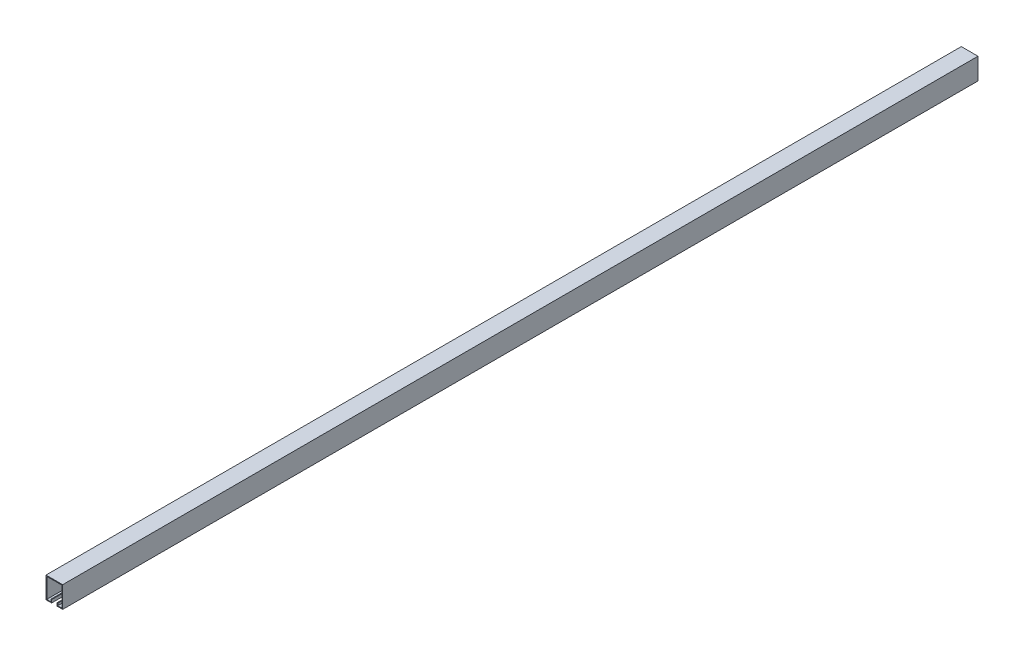
ISO-10303-21;
HEADER;
FILE_DESCRIPTION(('STEP AP214'),'2;1');
FILE_NAME('part.step','',(''),(''),'','','');
FILE_SCHEMA(('AUTOMOTIVE_DESIGN { 1 0 10303 214 1 1 1 1 }'));
ENDSEC;
DATA;
#1=APPLICATION_CONTEXT('core data for automotive mechanical design processes');
#2=APPLICATION_PROTOCOL_DEFINITION('international standard','automotive_design',2000,#1);
#3=PRODUCT_CONTEXT('',#1,'mechanical');
#4=PRODUCT('Part','Part','',(#3));
#5=PRODUCT_RELATED_PRODUCT_CATEGORY('part','',(#4));
#6=PRODUCT_DEFINITION_FORMATION('','',#4);
#7=PRODUCT_DEFINITION_CONTEXT('part definition',#1,'design');
#8=PRODUCT_DEFINITION('design','',#6,#7);
#9=PRODUCT_DEFINITION_SHAPE('','',#8);
#10=(LENGTH_UNIT() NAMED_UNIT(*) SI_UNIT(.MILLI.,.METRE.));
#11=(NAMED_UNIT(*) PLANE_ANGLE_UNIT() SI_UNIT($,.RADIAN.));
#12=(NAMED_UNIT(*) SI_UNIT($,.STERADIAN.) SOLID_ANGLE_UNIT());
#13=UNCERTAINTY_MEASURE_WITH_UNIT(LENGTH_MEASURE(1.E-05),#10,'distance_accuracy_value','');
#14=(GEOMETRIC_REPRESENTATION_CONTEXT(3) GLOBAL_UNCERTAINTY_ASSIGNED_CONTEXT((#13)) GLOBAL_UNIT_ASSIGNED_CONTEXT((#10,
#11,#12)) REPRESENTATION_CONTEXT('',''));
#15=CARTESIAN_POINT('',(0.,0.,0.));
#16=DIRECTION('',(0.,0.,1.));
#17=DIRECTION('',(1.,0.,0.));
#18=AXIS2_PLACEMENT_3D('',#15,#16,#17);
#19=CARTESIAN_POINT('',(0.,-57.15,2440.));
#20=DIRECTION('',(0.,1.,0.));
#21=DIRECTION('',(0.,0.,1.));
#22=AXIS2_PLACEMENT_3D('',#19,#20,#21);
#23=PLANE('',#22);
#24=DIRECTION('',(1.,0.,0.));
#25=VECTOR('',#24,1.);
#26=CARTESIAN_POINT('',(0.,-57.15,0.));
#27=LINE('',#26,#25);
#28=CARTESIAN_POINT('',(0.,-57.15,0.));
#29=VERTEX_POINT('',#28);
#30=CARTESIAN_POINT('',(15.,-57.15,0.));
#31=VERTEX_POINT('',#30);
#32=EDGE_CURVE('E190',#29,#31,#27,.T.);
#33=ORIENTED_EDGE('',*,*,#32,.T.);
#34=DIRECTION('',(0.,0.,1.));
#35=VECTOR('',#34,1.);
#36=CARTESIAN_POINT('',(15.,-57.15,-68.3938959264641));
#37=LINE('',#36,#35);
#38=CARTESIAN_POINT('',(15.,-57.15,2440.));
#39=VERTEX_POINT('',#38);
#40=EDGE_CURVE('E374',#31,#39,#37,.T.);
#41=ORIENTED_EDGE('',*,*,#40,.T.);
#42=DIRECTION('',(1.,0.,0.));
#43=VECTOR('',#42,1.);
#44=CARTESIAN_POINT('',(0.,-57.15,2440.));
#45=LINE('',#44,#43);
#46=CARTESIAN_POINT('',(0.,-57.15,2440.));
#47=VERTEX_POINT('',#46);
#48=EDGE_CURVE('E85',#47,#39,#45,.T.);
#49=ORIENTED_EDGE('',*,*,#48,.F.);
#50=DIRECTION('',(0.,0.,-1.));
#51=VECTOR('',#50,1.);
#52=CARTESIAN_POINT('',(0.,-57.15,2440.));
#53=LINE('',#52,#51);
#54=EDGE_CURVE('E11',#47,#29,#53,.T.);
#55=ORIENTED_EDGE('',*,*,#54,.T.);
#56=EDGE_LOOP('',(#33,#41,#49,#55));
#57=FACE_BOUND('',#56,.T.);
#58=ADVANCED_FACE('F33',(#57),#23,.F.);
#59=CARTESIAN_POINT('',(0.,0.,2440.));
#60=DIRECTION('',(1.,0.,0.));
#61=DIRECTION('',(0.,1.,0.));
#62=AXIS2_PLACEMENT_3D('',#59,#60,#61);
#63=PLANE('',#62);
#64=DIRECTION('',(0.,-1.,0.));
#65=VECTOR('',#64,1.);
#66=CARTESIAN_POINT('',(0.,0.,0.));
#67=LINE('',#66,#65);
#68=CARTESIAN_POINT('',(0.,0.,0.));
#69=VERTEX_POINT('',#68);
#70=EDGE_CURVE('E186',#69,#29,#67,.T.);
#71=ORIENTED_EDGE('',*,*,#70,.T.);
#72=ORIENTED_EDGE('',*,*,#54,.F.);
#73=DIRECTION('',(0.,-1.,0.));
#74=VECTOR('',#73,1.);
#75=CARTESIAN_POINT('',(0.,0.,2440.));
#76=LINE('',#75,#74);
#77=CARTESIAN_POINT('',(0.,0.,2440.));
#78=VERTEX_POINT('',#77);
#79=EDGE_CURVE('E177',#78,#47,#76,.T.);
#80=ORIENTED_EDGE('',*,*,#79,.F.);
#81=DIRECTION('',(0.,0.,-1.));
#82=VECTOR('',#81,1.);
#83=CARTESIAN_POINT('',(0.,0.,2440.));
#84=LINE('',#83,#82);
#85=EDGE_CURVE('E185',#78,#69,#84,.T.);
#86=ORIENTED_EDGE('',*,*,#85,.T.);
#87=EDGE_LOOP('',(#71,#72,#80,#86));
#88=FACE_BOUND('',#87,.T.);
#89=ADVANCED_FACE('F35',(#88),#63,.F.);
#90=CARTESIAN_POINT('',(29.45,-57.15,2440.));
#91=VERTEX_POINT('',#90);
#92=CARTESIAN_POINT('',(44.45,-57.15,2440.));
#93=VERTEX_POINT('',#92);
#94=EDGE_CURVE('E168',#91,#93,#45,.T.);
#95=ORIENTED_EDGE('',*,*,#94,.F.);
#96=DIRECTION('',(0.,0.,1.));
#97=VECTOR('',#96,1.);
#98=CARTESIAN_POINT('',(29.45,-57.15,-68.3938959264641));
#99=LINE('',#98,#97);
#100=CARTESIAN_POINT('',(29.45,-57.15,0.));
#101=VERTEX_POINT('',#100);
#102=EDGE_CURVE('E154',#101,#91,#99,.T.);
#103=ORIENTED_EDGE('',*,*,#102,.F.);
#104=CARTESIAN_POINT('',(44.45,-57.15,0.));
#105=VERTEX_POINT('',#104);
#106=EDGE_CURVE('E189',#101,#105,#27,.T.);
#107=ORIENTED_EDGE('',*,*,#106,.T.);
#108=DIRECTION('',(0.,0.,-1.));
#109=VECTOR('',#108,1.);
#110=CARTESIAN_POINT('',(44.45,-57.15,2440.));
#111=LINE('',#110,#109);
#112=EDGE_CURVE('E41',#93,#105,#111,.T.);
#113=ORIENTED_EDGE('',*,*,#112,.F.);
#114=EDGE_LOOP('',(#95,#103,#107,#113));
#115=FACE_BOUND('',#114,.T.);
#116=ADVANCED_FACE('F174',(#115),#23,.F.);
#117=CARTESIAN_POINT('',(44.45,0.,2440.));
#118=DIRECTION('',(-1.,0.,0.));
#119=DIRECTION('',(0.,0.,1.));
#120=AXIS2_PLACEMENT_3D('',#117,#118,#119);
#121=PLANE('',#120);
#122=DIRECTION('',(0.,1.,0.));
#123=VECTOR('',#122,1.);
#124=CARTESIAN_POINT('',(44.45,0.,0.));
#125=LINE('',#124,#123);
#126=CARTESIAN_POINT('',(44.45,0.,0.));
#127=VERTEX_POINT('',#126);
#128=EDGE_CURVE('E193',#105,#127,#125,.T.);
#129=ORIENTED_EDGE('',*,*,#128,.T.);
#130=DIRECTION('',(0.,0.,-1.));
#131=VECTOR('',#130,1.);
#132=CARTESIAN_POINT('',(44.45,0.,2440.));
#133=LINE('',#132,#131);
#134=CARTESIAN_POINT('',(44.45,0.,2440.));
#135=VERTEX_POINT('',#134);
#136=EDGE_CURVE('E197',#135,#127,#133,.T.);
#137=ORIENTED_EDGE('',*,*,#136,.F.);
#138=DIRECTION('',(0.,1.,0.));
#139=VECTOR('',#138,1.);
#140=CARTESIAN_POINT('',(44.45,0.,2440.));
#141=LINE('',#140,#139);
#142=EDGE_CURVE('E179',#93,#135,#141,.T.);
#143=ORIENTED_EDGE('',*,*,#142,.F.);
#144=ORIENTED_EDGE('',*,*,#112,.T.);
#145=EDGE_LOOP('',(#129,#137,#143,#144));
#146=FACE_BOUND('',#145,.T.);
#147=ADVANCED_FACE('F200',(#146),#121,.F.);
#148=CARTESIAN_POINT('',(0.,0.,2440.));
#149=DIRECTION('',(0.,-1.,0.));
#150=DIRECTION('',(0.,0.,-1.));
#151=AXIS2_PLACEMENT_3D('',#148,#149,#150);
#152=PLANE('',#151);
#153=DIRECTION('',(-1.,0.,0.));
#154=VECTOR('',#153,1.);
#155=CARTESIAN_POINT('',(0.,0.,0.));
#156=LINE('',#155,#154);
#157=EDGE_CURVE('E78',#127,#69,#156,.T.);
#158=ORIENTED_EDGE('',*,*,#157,.T.);
#159=ORIENTED_EDGE('',*,*,#85,.F.);
#160=DIRECTION('',(-1.,0.,0.));
#161=VECTOR('',#160,1.);
#162=CARTESIAN_POINT('',(0.,0.,2440.));
#163=LINE('',#162,#161);
#164=EDGE_CURVE('E57',#135,#78,#163,.T.);
#165=ORIENTED_EDGE('',*,*,#164,.F.);
#166=ORIENTED_EDGE('',*,*,#136,.T.);
#167=EDGE_LOOP('',(#158,#159,#165,#166));
#168=FACE_BOUND('',#167,.T.);
#169=ADVANCED_FACE('F210',(#168),#152,.F.);
#170=CARTESIAN_POINT('',(0.,0.,2440.));
#171=DIRECTION('',(0.,0.,1.));
#172=DIRECTION('',(1.,0.,0.));
#173=AXIS2_PLACEMENT_3D('',#170,#171,#172);
#174=PLANE('',#173);
#175=DIRECTION('',(0.,-1.,0.));
#176=VECTOR('',#175,1.);
#177=CARTESIAN_POINT('',(15.,-57.15,2440.));
#178=LINE('',#177,#176);
#179=CARTESIAN_POINT('',(15.,-49.15,2440.));
#180=VERTEX_POINT('',#179);
#181=EDGE_CURVE('E164',#180,#39,#178,.T.);
#182=ORIENTED_EDGE('',*,*,#181,.F.);
#183=DIRECTION('',(1.,0.,0.));
#184=VECTOR('',#183,1.);
#185=CARTESIAN_POINT('',(15.,-49.15,2440.));
#186=LINE('',#185,#184);
#187=CARTESIAN_POINT('',(13.,-49.15,2440.));
#188=VERTEX_POINT('',#187);
#189=EDGE_CURVE('E400',#188,#180,#186,.T.);
#190=ORIENTED_EDGE('',*,*,#189,.F.);
#191=DIRECTION('',(0.,1.,0.));
#192=VECTOR('',#191,1.);
#193=CARTESIAN_POINT('',(13.,-49.15,2440.));
#194=LINE('',#193,#192);
#195=CARTESIAN_POINT('',(13.,-55.15,2440.));
#196=VERTEX_POINT('',#195);
#197=EDGE_CURVE('E403',#196,#188,#194,.T.);
#198=ORIENTED_EDGE('',*,*,#197,.F.);
#199=DIRECTION('',(1.,0.,0.));
#200=VECTOR('',#199,1.);
#201=CARTESIAN_POINT('',(13.,-55.15,2440.));
#202=LINE('',#201,#200);
#203=CARTESIAN_POINT('',(2.,-55.15,2440.));
#204=VERTEX_POINT('',#203);
#205=EDGE_CURVE('E406',#204,#196,#202,.T.);
#206=ORIENTED_EDGE('',*,*,#205,.F.);
#207=DIRECTION('',(0.,-1.,0.));
#208=VECTOR('',#207,1.);
#209=CARTESIAN_POINT('',(2.,-55.15,2440.));
#210=LINE('',#209,#208);
#211=CARTESIAN_POINT('',(2.,-2.,2440.));
#212=VERTEX_POINT('',#211);
#213=EDGE_CURVE('E409',#212,#204,#210,.T.);
#214=ORIENTED_EDGE('',*,*,#213,.F.);
#215=DIRECTION('',(-1.,0.,0.));
#216=VECTOR('',#215,1.);
#217=CARTESIAN_POINT('',(2.,-2.,2440.));
#218=LINE('',#217,#216);
#219=CARTESIAN_POINT('',(42.45,-2.,2440.));
#220=VERTEX_POINT('',#219);
#221=EDGE_CURVE('E412',#220,#212,#218,.T.);
#222=ORIENTED_EDGE('',*,*,#221,.F.);
#223=DIRECTION('',(0.,1.,0.));
#224=VECTOR('',#223,1.);
#225=CARTESIAN_POINT('',(42.45,-2.,2440.));
#226=LINE('',#225,#224);
#227=CARTESIAN_POINT('',(42.45,-55.15,2440.));
#228=VERTEX_POINT('',#227);
#229=EDGE_CURVE('E415',#228,#220,#226,.T.);
#230=ORIENTED_EDGE('',*,*,#229,.F.);
#231=DIRECTION('',(1.,0.,0.));
#232=VECTOR('',#231,1.);
#233=CARTESIAN_POINT('',(42.45,-55.15,2440.));
#234=LINE('',#233,#232);
#235=CARTESIAN_POINT('',(31.45,-55.15,2440.));
#236=VERTEX_POINT('',#235);
#237=EDGE_CURVE('E418',#236,#228,#234,.T.);
#238=ORIENTED_EDGE('',*,*,#237,.F.);
#239=DIRECTION('',(0.,-1.,0.));
#240=VECTOR('',#239,1.);
#241=CARTESIAN_POINT('',(31.45,-55.15,2440.));
#242=LINE('',#241,#240);
#243=CARTESIAN_POINT('',(31.45,-49.15,2440.));
#244=VERTEX_POINT('',#243);
#245=EDGE_CURVE('E421',#244,#236,#242,.T.);
#246=ORIENTED_EDGE('',*,*,#245,.F.);
#247=DIRECTION('',(1.,0.,0.));
#248=VECTOR('',#247,1.);
#249=CARTESIAN_POINT('',(31.45,-49.15,2440.));
#250=LINE('',#249,#248);
#251=CARTESIAN_POINT('',(29.45,-49.15,2440.));
#252=VERTEX_POINT('',#251);
#253=EDGE_CURVE('E172',#252,#244,#250,.T.);
#254=ORIENTED_EDGE('',*,*,#253,.F.);
#255=DIRECTION('',(0.,1.,0.));
#256=VECTOR('',#255,1.);
#257=CARTESIAN_POINT('',(29.45,-49.15,2440.));
#258=LINE('',#257,#256);
#259=EDGE_CURVE('E157',#91,#252,#258,.T.);
#260=ORIENTED_EDGE('',*,*,#259,.F.);
#261=ORIENTED_EDGE('',*,*,#94,.T.);
#262=ORIENTED_EDGE('',*,*,#142,.T.);
#263=ORIENTED_EDGE('',*,*,#164,.T.);
#264=ORIENTED_EDGE('',*,*,#79,.T.);
#265=ORIENTED_EDGE('',*,*,#48,.T.);
#266=EDGE_LOOP('',(#182,#190,#198,#206,#214,#222,#230,#238,#246,#254,#260,#261,#262,#263,#264,#265));
#267=FACE_BOUND('',#266,.T.);
#268=ADVANCED_FACE('F167',(#267),#174,.T.);
#269=CARTESIAN_POINT('',(0.,0.,0.));
#270=DIRECTION('',(0.,0.,1.));
#271=DIRECTION('',(1.,0.,0.));
#272=AXIS2_PLACEMENT_3D('',#269,#270,#271);
#273=PLANE('',#272);
#274=DIRECTION('',(-1.,0.,0.));
#275=VECTOR('',#274,1.);
#276=CARTESIAN_POINT('',(15.,-49.15,0.));
#277=LINE('',#276,#275);
#278=CARTESIAN_POINT('',(15.,-49.15,0.));
#279=VERTEX_POINT('',#278);
#280=CARTESIAN_POINT('',(13.,-49.15,0.));
#281=VERTEX_POINT('',#280);
#282=EDGE_CURVE('E377',#279,#281,#277,.T.);
#283=ORIENTED_EDGE('',*,*,#282,.F.);
#284=DIRECTION('',(0.,1.,0.));
#285=VECTOR('',#284,1.);
#286=CARTESIAN_POINT('',(15.,-57.15,0.));
#287=LINE('',#286,#285);
#288=EDGE_CURVE('E376',#31,#279,#287,.T.);
#289=ORIENTED_EDGE('',*,*,#288,.F.);
#290=ORIENTED_EDGE('',*,*,#32,.F.);
#291=ORIENTED_EDGE('',*,*,#70,.F.);
#292=ORIENTED_EDGE('',*,*,#157,.F.);
#293=ORIENTED_EDGE('',*,*,#128,.F.);
#294=ORIENTED_EDGE('',*,*,#106,.F.);
#295=DIRECTION('',(0.,-1.,0.));
#296=VECTOR('',#295,1.);
#297=CARTESIAN_POINT('',(29.45,-49.15,0.));
#298=LINE('',#297,#296);
#299=CARTESIAN_POINT('',(29.45,-49.15,0.));
#300=VERTEX_POINT('',#299);
#301=EDGE_CURVE('E160',#300,#101,#298,.T.);
#302=ORIENTED_EDGE('',*,*,#301,.F.);
#303=DIRECTION('',(-1.,0.,0.));
#304=VECTOR('',#303,1.);
#305=CARTESIAN_POINT('',(31.45,-49.15,0.));
#306=LINE('',#305,#304);
#307=CARTESIAN_POINT('',(31.45,-49.15,0.));
#308=VERTEX_POINT('',#307);
#309=EDGE_CURVE('E370',#308,#300,#306,.T.);
#310=ORIENTED_EDGE('',*,*,#309,.F.);
#311=DIRECTION('',(0.,1.,0.));
#312=VECTOR('',#311,1.);
#313=CARTESIAN_POINT('',(31.45,-55.15,0.));
#314=LINE('',#313,#312);
#315=CARTESIAN_POINT('',(31.45,-55.15,0.));
#316=VERTEX_POINT('',#315);
#317=EDGE_CURVE('E373',#316,#308,#314,.T.);
#318=ORIENTED_EDGE('',*,*,#317,.F.);
#319=DIRECTION('',(-1.,0.,0.));
#320=VECTOR('',#319,1.);
#321=CARTESIAN_POINT('',(42.45,-55.15,0.));
#322=LINE('',#321,#320);
#323=CARTESIAN_POINT('',(42.45,-55.15,0.));
#324=VERTEX_POINT('',#323);
#325=EDGE_CURVE('E436',#324,#316,#322,.T.);
#326=ORIENTED_EDGE('',*,*,#325,.F.);
#327=DIRECTION('',(0.,-1.,0.));
#328=VECTOR('',#327,1.);
#329=CARTESIAN_POINT('',(42.45,-2.,0.));
#330=LINE('',#329,#328);
#331=CARTESIAN_POINT('',(42.45,-2.,0.));
#332=VERTEX_POINT('',#331);
#333=EDGE_CURVE('E434',#332,#324,#330,.T.);
#334=ORIENTED_EDGE('',*,*,#333,.F.);
#335=DIRECTION('',(1.,0.,0.));
#336=VECTOR('',#335,1.);
#337=CARTESIAN_POINT('',(2.,-2.,0.));
#338=LINE('',#337,#336);
#339=CARTESIAN_POINT('',(2.,-2.,0.));
#340=VERTEX_POINT('',#339);
#341=EDGE_CURVE('E432',#340,#332,#338,.T.);
#342=ORIENTED_EDGE('',*,*,#341,.F.);
#343=DIRECTION('',(0.,1.,0.));
#344=VECTOR('',#343,1.);
#345=CARTESIAN_POINT('',(2.,-55.15,0.));
#346=LINE('',#345,#344);
#347=CARTESIAN_POINT('',(2.,-55.15,0.));
#348=VERTEX_POINT('',#347);
#349=EDGE_CURVE('E430',#348,#340,#346,.T.);
#350=ORIENTED_EDGE('',*,*,#349,.F.);
#351=DIRECTION('',(-1.,0.,0.));
#352=VECTOR('',#351,1.);
#353=CARTESIAN_POINT('',(13.,-55.15,0.));
#354=LINE('',#353,#352);
#355=CARTESIAN_POINT('',(13.,-55.15,0.));
#356=VERTEX_POINT('',#355);
#357=EDGE_CURVE('E428',#356,#348,#354,.T.);
#358=ORIENTED_EDGE('',*,*,#357,.F.);
#359=DIRECTION('',(0.,-1.,0.));
#360=VECTOR('',#359,1.);
#361=CARTESIAN_POINT('',(13.,-49.15,0.));
#362=LINE('',#361,#360);
#363=EDGE_CURVE('E426',#281,#356,#362,.T.);
#364=ORIENTED_EDGE('',*,*,#363,.F.);
#365=EDGE_LOOP('',(#283,#289,#290,#291,#292,#293,#294,#302,#310,#318,#326,#334,#342,#350,#358,#364));
#366=FACE_BOUND('',#365,.T.);
#367=ADVANCED_FACE('F204',(#366),#273,.F.);
#368=CARTESIAN_POINT('',(15.,-57.15,-68.3938959264641));
#369=DIRECTION('',(-1.,0.,0.));
#370=DIRECTION('',(0.,0.,1.));
#371=AXIS2_PLACEMENT_3D('',#368,#369,#370);
#372=PLANE('',#371);
#373=ORIENTED_EDGE('',*,*,#288,.T.);
#374=DIRECTION('',(0.,0.,1.));
#375=VECTOR('',#374,1.);
#376=CARTESIAN_POINT('',(15.,-49.15,-68.3938959264641));
#377=LINE('',#376,#375);
#378=EDGE_CURVE('E396',#279,#180,#377,.T.);
#379=ORIENTED_EDGE('',*,*,#378,.T.);
#380=ORIENTED_EDGE('',*,*,#181,.T.);
#381=ORIENTED_EDGE('',*,*,#40,.F.);
#382=EDGE_LOOP('',(#373,#379,#380,#381));
#383=FACE_BOUND('',#382,.T.);
#384=ADVANCED_FACE('F254',(#383),#372,.F.);
#385=CARTESIAN_POINT('',(15.,-49.15,-68.3938959264641));
#386=DIRECTION('',(0.,-1.,0.));
#387=DIRECTION('',(0.,0.,-1.));
#388=AXIS2_PLACEMENT_3D('',#385,#386,#387);
#389=PLANE('',#388);
#390=ORIENTED_EDGE('',*,*,#282,.T.);
#391=DIRECTION('',(0.,0.,1.));
#392=VECTOR('',#391,1.);
#393=CARTESIAN_POINT('',(13.,-49.15,-68.3938959264641));
#394=LINE('',#393,#392);
#395=EDGE_CURVE('E394',#281,#188,#394,.T.);
#396=ORIENTED_EDGE('',*,*,#395,.T.);
#397=ORIENTED_EDGE('',*,*,#189,.T.);
#398=ORIENTED_EDGE('',*,*,#378,.F.);
#399=EDGE_LOOP('',(#390,#396,#397,#398));
#400=FACE_BOUND('',#399,.T.);
#401=ADVANCED_FACE('F260',(#400),#389,.F.);
#402=CARTESIAN_POINT('',(13.,-49.15,-68.3938959264641));
#403=DIRECTION('',(1.,0.,0.));
#404=DIRECTION('',(0.,1.,0.));
#405=AXIS2_PLACEMENT_3D('',#402,#403,#404);
#406=PLANE('',#405);
#407=ORIENTED_EDGE('',*,*,#363,.T.);
#408=DIRECTION('',(0.,0.,1.));
#409=VECTOR('',#408,1.);
#410=CARTESIAN_POINT('',(13.,-55.15,-68.3938959264641));
#411=LINE('',#410,#409);
#412=EDGE_CURVE('E392',#356,#196,#411,.T.);
#413=ORIENTED_EDGE('',*,*,#412,.T.);
#414=ORIENTED_EDGE('',*,*,#197,.T.);
#415=ORIENTED_EDGE('',*,*,#395,.F.);
#416=EDGE_LOOP('',(#407,#413,#414,#415));
#417=FACE_BOUND('',#416,.T.);
#418=ADVANCED_FACE('F269',(#417),#406,.F.);
#419=CARTESIAN_POINT('',(13.,-55.15,-68.3938959264641));
#420=DIRECTION('',(0.,-1.,0.));
#421=DIRECTION('',(0.,0.,-1.));
#422=AXIS2_PLACEMENT_3D('',#419,#420,#421);
#423=PLANE('',#422);
#424=ORIENTED_EDGE('',*,*,#357,.T.);
#425=DIRECTION('',(0.,0.,1.));
#426=VECTOR('',#425,1.);
#427=CARTESIAN_POINT('',(2.,-55.15,-68.3938959264641));
#428=LINE('',#427,#426);
#429=EDGE_CURVE('E390',#348,#204,#428,.T.);
#430=ORIENTED_EDGE('',*,*,#429,.T.);
#431=ORIENTED_EDGE('',*,*,#205,.T.);
#432=ORIENTED_EDGE('',*,*,#412,.F.);
#433=EDGE_LOOP('',(#424,#430,#431,#432));
#434=FACE_BOUND('',#433,.T.);
#435=ADVANCED_FACE('F278',(#434),#423,.F.);
#436=CARTESIAN_POINT('',(2.,-55.15,-68.3938959264641));
#437=DIRECTION('',(-1.,0.,0.));
#438=DIRECTION('',(0.,0.,1.));
#439=AXIS2_PLACEMENT_3D('',#436,#437,#438);
#440=PLANE('',#439);
#441=ORIENTED_EDGE('',*,*,#349,.T.);
#442=DIRECTION('',(0.,0.,1.));
#443=VECTOR('',#442,1.);
#444=CARTESIAN_POINT('',(2.,-2.,-68.3938959264641));
#445=LINE('',#444,#443);
#446=EDGE_CURVE('E388',#340,#212,#445,.T.);
#447=ORIENTED_EDGE('',*,*,#446,.T.);
#448=ORIENTED_EDGE('',*,*,#213,.T.);
#449=ORIENTED_EDGE('',*,*,#429,.F.);
#450=EDGE_LOOP('',(#441,#447,#448,#449));
#451=FACE_BOUND('',#450,.T.);
#452=ADVANCED_FACE('F287',(#451),#440,.F.);
#453=CARTESIAN_POINT('',(2.,-2.,-68.3938959264641));
#454=DIRECTION('',(0.,1.,0.));
#455=DIRECTION('',(0.,0.,1.));
#456=AXIS2_PLACEMENT_3D('',#453,#454,#455);
#457=PLANE('',#456);
#458=ORIENTED_EDGE('',*,*,#341,.T.);
#459=DIRECTION('',(0.,0.,1.));
#460=VECTOR('',#459,1.);
#461=CARTESIAN_POINT('',(42.45,-2.,-68.3938959264641));
#462=LINE('',#461,#460);
#463=EDGE_CURVE('E386',#332,#220,#462,.T.);
#464=ORIENTED_EDGE('',*,*,#463,.T.);
#465=ORIENTED_EDGE('',*,*,#221,.T.);
#466=ORIENTED_EDGE('',*,*,#446,.F.);
#467=EDGE_LOOP('',(#458,#464,#465,#466));
#468=FACE_BOUND('',#467,.T.);
#469=ADVANCED_FACE('F296',(#468),#457,.F.);
#470=CARTESIAN_POINT('',(42.45,-2.,-68.3938959264641));
#471=DIRECTION('',(1.,0.,0.));
#472=DIRECTION('',(0.,1.,0.));
#473=AXIS2_PLACEMENT_3D('',#470,#471,#472);
#474=PLANE('',#473);
#475=ORIENTED_EDGE('',*,*,#333,.T.);
#476=DIRECTION('',(0.,0.,1.));
#477=VECTOR('',#476,1.);
#478=CARTESIAN_POINT('',(42.45,-55.15,-68.3938959264641));
#479=LINE('',#478,#477);
#480=EDGE_CURVE('E384',#324,#228,#479,.T.);
#481=ORIENTED_EDGE('',*,*,#480,.T.);
#482=ORIENTED_EDGE('',*,*,#229,.T.);
#483=ORIENTED_EDGE('',*,*,#463,.F.);
#484=EDGE_LOOP('',(#475,#481,#482,#483));
#485=FACE_BOUND('',#484,.T.);
#486=ADVANCED_FACE('F305',(#485),#474,.F.);
#487=CARTESIAN_POINT('',(42.45,-55.15,-68.3938959264641));
#488=DIRECTION('',(0.,-1.,0.));
#489=DIRECTION('',(1.,0.,0.));
#490=AXIS2_PLACEMENT_3D('',#487,#488,#489);
#491=PLANE('',#490);
#492=ORIENTED_EDGE('',*,*,#325,.T.);
#493=DIRECTION('',(0.,0.,1.));
#494=VECTOR('',#493,1.);
#495=CARTESIAN_POINT('',(31.45,-55.15,-68.3938959264641));
#496=LINE('',#495,#494);
#497=EDGE_CURVE('E382',#316,#236,#496,.T.);
#498=ORIENTED_EDGE('',*,*,#497,.T.);
#499=ORIENTED_EDGE('',*,*,#237,.T.);
#500=ORIENTED_EDGE('',*,*,#480,.F.);
#501=EDGE_LOOP('',(#492,#498,#499,#500));
#502=FACE_BOUND('',#501,.T.);
#503=ADVANCED_FACE('F314',(#502),#491,.F.);
#504=CARTESIAN_POINT('',(31.45,-55.15,-68.3938959264641));
#505=DIRECTION('',(-1.,0.,0.));
#506=DIRECTION('',(0.,0.,1.));
#507=AXIS2_PLACEMENT_3D('',#504,#505,#506);
#508=PLANE('',#507);
#509=ORIENTED_EDGE('',*,*,#317,.T.);
#510=DIRECTION('',(0.,0.,1.));
#511=VECTOR('',#510,1.);
#512=CARTESIAN_POINT('',(31.45,-49.15,-68.3938959264641));
#513=LINE('',#512,#511);
#514=EDGE_CURVE('E371',#308,#244,#513,.T.);
#515=ORIENTED_EDGE('',*,*,#514,.T.);
#516=ORIENTED_EDGE('',*,*,#245,.T.);
#517=ORIENTED_EDGE('',*,*,#497,.F.);
#518=EDGE_LOOP('',(#509,#515,#516,#517));
#519=FACE_BOUND('',#518,.T.);
#520=ADVANCED_FACE('F323',(#519),#508,.F.);
#521=CARTESIAN_POINT('',(31.45,-49.15,-68.3938959264641));
#522=DIRECTION('',(0.,-1.,0.));
#523=DIRECTION('',(0.,0.,-1.));
#524=AXIS2_PLACEMENT_3D('',#521,#522,#523);
#525=PLANE('',#524);
#526=ORIENTED_EDGE('',*,*,#309,.T.);
#527=DIRECTION('',(0.,0.,1.));
#528=VECTOR('',#527,1.);
#529=CARTESIAN_POINT('',(29.45,-49.15,-68.3938959264641));
#530=LINE('',#529,#528);
#531=EDGE_CURVE('E48',#300,#252,#530,.T.);
#532=ORIENTED_EDGE('',*,*,#531,.T.);
#533=ORIENTED_EDGE('',*,*,#253,.T.);
#534=ORIENTED_EDGE('',*,*,#514,.F.);
#535=EDGE_LOOP('',(#526,#532,#533,#534));
#536=FACE_BOUND('',#535,.T.);
#537=ADVANCED_FACE('F332',(#536),#525,.F.);
#538=CARTESIAN_POINT('',(29.45,-49.15,-68.3938959264641));
#539=DIRECTION('',(1.,0.,0.));
#540=DIRECTION('',(0.,0.,-1.));
#541=AXIS2_PLACEMENT_3D('',#538,#539,#540);
#542=PLANE('',#541);
#543=ORIENTED_EDGE('',*,*,#301,.T.);
#544=ORIENTED_EDGE('',*,*,#102,.T.);
#545=ORIENTED_EDGE('',*,*,#259,.T.);
#546=ORIENTED_EDGE('',*,*,#531,.F.);
#547=EDGE_LOOP('',(#543,#544,#545,#546));
#548=FACE_BOUND('',#547,.T.);
#549=ADVANCED_FACE('F156',(#548),#542,.F.);
#550=CLOSED_SHELL('',(#58,#89,#116,#147,#169,#268,#367,#384,#401,#418,#435,#452,#469,#486,#503,
#520,#537,#549));
#551=MANIFOLD_SOLID_BREP('B2',#550);
#552=ADVANCED_BREP_SHAPE_REPRESENTATION('',(#18,#551),#14);
#553=SHAPE_DEFINITION_REPRESENTATION(#9,#552);
ENDSEC;
END-ISO-10303-21;
